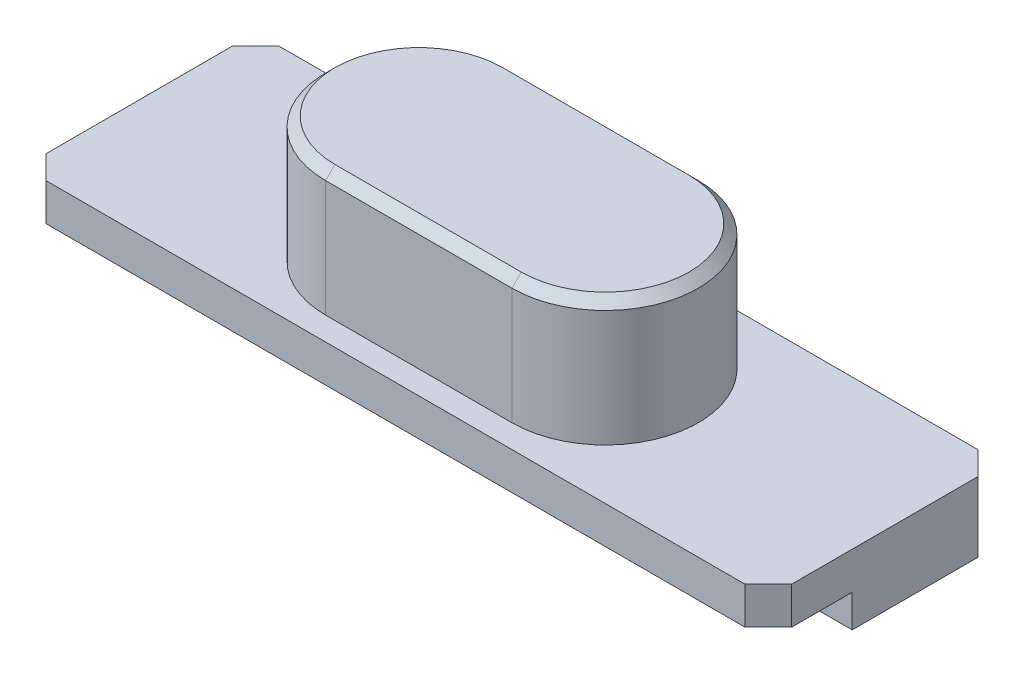
ISO-10303-21;
HEADER;
FILE_DESCRIPTION(('STEP AP214'),'2;1');
FILE_NAME('part.step','',(''),(''),'','','');
FILE_SCHEMA(('AUTOMOTIVE_DESIGN { 1 0 10303 214 1 1 1 1 }'));
ENDSEC;
DATA;
#1=APPLICATION_CONTEXT('core data for automotive mechanical design processes');
#2=APPLICATION_PROTOCOL_DEFINITION('international standard','automotive_design',2000,#1);
#3=PRODUCT_CONTEXT('',#1,'mechanical');
#4=PRODUCT('Part','Part','',(#3));
#5=PRODUCT_RELATED_PRODUCT_CATEGORY('part','',(#4));
#6=PRODUCT_DEFINITION_FORMATION('','',#4);
#7=PRODUCT_DEFINITION_CONTEXT('part definition',#1,'design');
#8=PRODUCT_DEFINITION('design','',#6,#7);
#9=PRODUCT_DEFINITION_SHAPE('','',#8);
#10=(LENGTH_UNIT() NAMED_UNIT(*) SI_UNIT(.MILLI.,.METRE.));
#11=(NAMED_UNIT(*) PLANE_ANGLE_UNIT() SI_UNIT($,.RADIAN.));
#12=(NAMED_UNIT(*) SI_UNIT($,.STERADIAN.) SOLID_ANGLE_UNIT());
#13=UNCERTAINTY_MEASURE_WITH_UNIT(LENGTH_MEASURE(1.E-05),#10,'distance_accuracy_value','');
#14=(GEOMETRIC_REPRESENTATION_CONTEXT(3) GLOBAL_UNCERTAINTY_ASSIGNED_CONTEXT((#13)) GLOBAL_UNIT_ASSIGNED_CONTEXT((#10,
#11,#12)) REPRESENTATION_CONTEXT('',''));
#15=CARTESIAN_POINT('',(0.,0.,0.));
#16=DIRECTION('',(0.,0.,1.));
#17=DIRECTION('',(1.,0.,0.));
#18=AXIS2_PLACEMENT_3D('',#15,#16,#17);
#19=CARTESIAN_POINT('',(0.7,-0.799999999999999,-2.5));
#20=DIRECTION('',(1.,0.,0.));
#21=DIRECTION('',(0.,1.,0.));
#22=AXIS2_PLACEMENT_3D('',#19,#20,#21);
#23=PLANE('',#22);
#24=DIRECTION('',(0.,1.,0.));
#25=VECTOR('',#24,1.);
#26=CARTESIAN_POINT('',(0.699999999999999,-0.8,0.700000000000002));
#27=LINE('',#26,#25);
#28=CARTESIAN_POINT('',(0.699999999999999,-2.,0.700000000000002));
#29=VERTEX_POINT('',#28);
#30=CARTESIAN_POINT('',(0.699999999999999,-0.799999999999999,0.700000000000002));
#31=VERTEX_POINT('',#30);
#32=EDGE_CURVE('E214',#29,#31,#27,.T.);
#33=ORIENTED_EDGE('',*,*,#32,.T.);
#34=DIRECTION('',(0.,0.,1.));
#35=VECTOR('',#34,1.);
#36=CARTESIAN_POINT('',(0.699999999999999,-0.799999999999999,-2.5));
#37=LINE('',#36,#35);
#38=CARTESIAN_POINT('',(0.699999999999999,-0.799999999999999,-2.5));
#39=VERTEX_POINT('',#38);
#40=EDGE_CURVE('E299',#31,#39,#37,.F.);
#41=ORIENTED_EDGE('',*,*,#40,.T.);
#42=DIRECTION('',(0.,1.,0.));
#43=VECTOR('',#42,1.);
#44=CARTESIAN_POINT('',(0.7,-0.799999999999999,-2.5));
#45=LINE('',#44,#43);
#46=CARTESIAN_POINT('',(0.699999999999999,-2.,-2.5));
#47=VERTEX_POINT('',#46);
#48=EDGE_CURVE('E227',#47,#39,#45,.T.);
#49=ORIENTED_EDGE('',*,*,#48,.F.);
#50=DIRECTION('',(0.,0.,-1.));
#51=VECTOR('',#50,1.);
#52=CARTESIAN_POINT('',(0.699999999999999,-2.,0.));
#53=LINE('',#52,#51);
#54=EDGE_CURVE('E277',#29,#47,#53,.T.);
#55=ORIENTED_EDGE('',*,*,#54,.F.);
#56=EDGE_LOOP('',(#33,#41,#49,#55));
#57=FACE_BOUND('',#56,.T.);
#58=ADVANCED_FACE('F17',(#57),#23,.F.);
#59=CARTESIAN_POINT('',(-3.,-1.5,-4.32464076412766));
#60=DIRECTION('',(1.,0.,0.));
#61=DIRECTION('',(0.,0.,-1.));
#62=AXIS2_PLACEMENT_3D('',#59,#60,#61);
#63=PLANE('',#62);
#64=DIRECTION('',(0.,1.,0.));
#65=VECTOR('',#64,1.);
#66=CARTESIAN_POINT('',(-3.,-0.8,0.700000000000002));
#67=LINE('',#66,#65);
#68=CARTESIAN_POINT('',(-3.,-2.,0.700000000000002));
#69=VERTEX_POINT('',#68);
#70=CARTESIAN_POINT('',(-3.,-1.5,0.700000000000002));
#71=VERTEX_POINT('',#70);
#72=EDGE_CURVE('E216',#69,#71,#67,.T.);
#73=ORIENTED_EDGE('',*,*,#72,.T.);
#74=DIRECTION('',(0.,0.,-1.));
#75=VECTOR('',#74,1.);
#76=CARTESIAN_POINT('',(-3.,-1.5,0.));
#77=LINE('',#76,#75);
#78=CARTESIAN_POINT('',(-3.,-1.5,-2.5));
#79=VERTEX_POINT('',#78);
#80=EDGE_CURVE('E266',#79,#71,#77,.F.);
#81=ORIENTED_EDGE('',*,*,#80,.F.);
#82=DIRECTION('',(0.,1.,0.));
#83=VECTOR('',#82,1.);
#84=CARTESIAN_POINT('',(-3.,-1.5,-2.5));
#85=LINE('',#84,#83);
#86=CARTESIAN_POINT('',(-3.,-2.,-2.5));
#87=VERTEX_POINT('',#86);
#88=EDGE_CURVE('E225',#87,#79,#85,.T.);
#89=ORIENTED_EDGE('',*,*,#88,.F.);
#90=DIRECTION('',(0.,0.,-1.));
#91=VECTOR('',#90,1.);
#92=CARTESIAN_POINT('',(-3.,-2.,0.));
#93=LINE('',#92,#91);
#94=EDGE_CURVE('E263',#69,#87,#93,.T.);
#95=ORIENTED_EDGE('',*,*,#94,.F.);
#96=EDGE_LOOP('',(#73,#81,#89,#95));
#97=FACE_BOUND('',#96,.T.);
#98=ADVANCED_FACE('F534',(#97),#63,.F.);
#99=CARTESIAN_POINT('',(-0.700000000000001,-0.799999999999999,-2.5));
#100=DIRECTION('',(-1.,0.,0.));
#101=DIRECTION('',(0.,-1.,0.));
#102=AXIS2_PLACEMENT_3D('',#99,#100,#101);
#103=PLANE('',#102);
#104=DIRECTION('',(0.,1.,0.));
#105=VECTOR('',#104,1.);
#106=CARTESIAN_POINT('',(-0.700000000000001,-0.8,0.700000000000002));
#107=LINE('',#106,#105);
#108=CARTESIAN_POINT('',(-0.700000000000001,-0.8,0.700000000000002));
#109=VERTEX_POINT('',#108);
#110=CARTESIAN_POINT('',(-0.700000000000001,-2.,0.700000000000002));
#111=VERTEX_POINT('',#110);
#112=EDGE_CURVE('E218',#109,#111,#107,.F.);
#113=ORIENTED_EDGE('',*,*,#112,.T.);
#114=DIRECTION('',(0.,0.,-1.));
#115=VECTOR('',#114,1.);
#116=CARTESIAN_POINT('',(-0.700000000000001,-2.,0.));
#117=LINE('',#116,#115);
#118=CARTESIAN_POINT('',(-0.700000000000001,-2.,-2.5));
#119=VERTEX_POINT('',#118);
#120=EDGE_CURVE('E261',#119,#111,#117,.F.);
#121=ORIENTED_EDGE('',*,*,#120,.F.);
#122=DIRECTION('',(0.,-1.,0.));
#123=VECTOR('',#122,1.);
#124=CARTESIAN_POINT('',(-0.700000000000001,-0.799999999999999,-2.5));
#125=LINE('',#124,#123);
#126=CARTESIAN_POINT('',(-0.700000000000001,-0.799999999999999,-2.5));
#127=VERTEX_POINT('',#126);
#128=EDGE_CURVE('E223',#127,#119,#125,.T.);
#129=ORIENTED_EDGE('',*,*,#128,.F.);
#130=DIRECTION('',(0.,0.,1.));
#131=VECTOR('',#130,1.);
#132=CARTESIAN_POINT('',(-0.700000000000001,-0.799999999999999,-2.5));
#133=LINE('',#132,#131);
#134=EDGE_CURVE('E294',#127,#109,#133,.T.);
#135=ORIENTED_EDGE('',*,*,#134,.T.);
#136=EDGE_LOOP('',(#113,#121,#129,#135));
#137=FACE_BOUND('',#136,.T.);
#138=ADVANCED_FACE('F510',(#137),#103,.F.);
#139=CARTESIAN_POINT('',(-8.,-0.8,0.700000000000002));
#140=DIRECTION('',(0.,0.,-1.));
#141=DIRECTION('',(-1.,0.,0.));
#142=AXIS2_PLACEMENT_3D('',#139,#140,#141);
#143=PLANE('',#142);
#144=ORIENTED_EDGE('',*,*,#72,.F.);
#145=DIRECTION('',(1.,0.,0.));
#146=VECTOR('',#145,1.);
#147=CARTESIAN_POINT('',(-5.5,-2.,0.700000000000002));
#148=LINE('',#147,#146);
#149=EDGE_CURVE('E258',#111,#69,#148,.F.);
#150=ORIENTED_EDGE('',*,*,#149,.F.);
#151=ORIENTED_EDGE('',*,*,#112,.F.);
#152=DIRECTION('',(1.,0.,0.));
#153=VECTOR('',#152,1.);
#154=CARTESIAN_POINT('',(-0.700000000000001,-0.799999999999999,0.700000000000002));
#155=LINE('',#154,#153);
#156=CARTESIAN_POINT('',(-8.,-0.8,0.700000000000002));
#157=VERTEX_POINT('',#156);
#158=EDGE_CURVE('E291',#109,#157,#155,.F.);
#159=ORIENTED_EDGE('',*,*,#158,.T.);
#160=DIRECTION('',(0.,1.,0.));
#161=VECTOR('',#160,1.);
#162=CARTESIAN_POINT('',(-8.,-0.8,0.700000000000002));
#163=LINE('',#162,#161);
#164=CARTESIAN_POINT('',(-8.,-1.5,0.700000000000002));
#165=VERTEX_POINT('',#164);
#166=EDGE_CURVE('E221',#165,#157,#163,.T.);
#167=ORIENTED_EDGE('',*,*,#166,.F.);
#168=DIRECTION('',(1.,0.,0.));
#169=VECTOR('',#168,1.);
#170=CARTESIAN_POINT('',(0.,-1.5,0.700000000000002));
#171=LINE('',#170,#169);
#172=EDGE_CURVE('E271',#71,#165,#171,.F.);
#173=ORIENTED_EDGE('',*,*,#172,.F.);
#174=EDGE_LOOP('',(#144,#150,#151,#159,#167,#173));
#175=FACE_BOUND('',#174,.T.);
#176=ADVANCED_FACE('F505',(#175),#143,.F.);
#177=CARTESIAN_POINT('',(-8.,-0.8,0.700000000000002));
#178=DIRECTION('',(0.,0.,-1.));
#179=DIRECTION('',(-1.,0.,0.));
#180=AXIS2_PLACEMENT_3D('',#177,#178,#179);
#181=PLANE('',#180);
#182=DIRECTION('',(0.,1.,0.));
#183=VECTOR('',#182,1.);
#184=CARTESIAN_POINT('',(3.,-1.5,0.700000000000002));
#185=LINE('',#184,#183);
#186=CARTESIAN_POINT('',(3.,-2.,0.700000000000002));
#187=VERTEX_POINT('',#186);
#188=CARTESIAN_POINT('',(3.,-1.5,0.700000000000002));
#189=VERTEX_POINT('',#188);
#190=EDGE_CURVE('E208',#187,#189,#185,.T.);
#191=ORIENTED_EDGE('',*,*,#190,.T.);
#192=DIRECTION('',(1.,0.,0.));
#193=VECTOR('',#192,1.);
#194=CARTESIAN_POINT('',(0.,-1.5,0.700000000000002));
#195=LINE('',#194,#193);
#196=CARTESIAN_POINT('',(8.,-1.5,0.700000000000002));
#197=VERTEX_POINT('',#196);
#198=EDGE_CURVE('E67',#197,#189,#195,.F.);
#199=ORIENTED_EDGE('',*,*,#198,.F.);
#200=DIRECTION('',(0.,1.,0.));
#201=VECTOR('',#200,1.);
#202=CARTESIAN_POINT('',(8.,-0.8,0.700000000000002));
#203=LINE('',#202,#201);
#204=CARTESIAN_POINT('',(8.,-0.8,0.700000000000002));
#205=VERTEX_POINT('',#204);
#206=EDGE_CURVE('E212',#205,#197,#203,.F.);
#207=ORIENTED_EDGE('',*,*,#206,.F.);
#208=DIRECTION('',(1.,0.,0.));
#209=VECTOR('',#208,1.);
#210=CARTESIAN_POINT('',(-0.700000000000001,-0.799999999999999,0.700000000000002));
#211=LINE('',#210,#209);
#212=EDGE_CURVE('E204',#205,#31,#211,.F.);
#213=ORIENTED_EDGE('',*,*,#212,.T.);
#214=ORIENTED_EDGE('',*,*,#32,.F.);
#215=DIRECTION('',(1.,0.,0.));
#216=VECTOR('',#215,1.);
#217=CARTESIAN_POINT('',(-5.5,-2.,0.700000000000002));
#218=LINE('',#217,#216);
#219=EDGE_CURVE('E280',#187,#29,#218,.F.);
#220=ORIENTED_EDGE('',*,*,#219,.F.);
#221=EDGE_LOOP('',(#191,#199,#207,#213,#214,#220));
#222=FACE_BOUND('',#221,.T.);
#223=ADVANCED_FACE('F305',(#222),#181,.F.);
#224=CARTESIAN_POINT('',(3.,-1.5,-3.78658965154207));
#225=DIRECTION('',(-1.,0.,0.));
#226=DIRECTION('',(0.,0.,1.));
#227=AXIS2_PLACEMENT_3D('',#224,#225,#226);
#228=PLANE('',#227);
#229=ORIENTED_EDGE('',*,*,#190,.F.);
#230=DIRECTION('',(0.,0.,-1.));
#231=VECTOR('',#230,1.);
#232=CARTESIAN_POINT('',(3.,-2.,0.));
#233=LINE('',#232,#231);
#234=CARTESIAN_POINT('',(3.,-2.,-2.5));
#235=VERTEX_POINT('',#234);
#236=EDGE_CURVE('E283',#235,#187,#233,.F.);
#237=ORIENTED_EDGE('',*,*,#236,.F.);
#238=DIRECTION('',(0.,1.,0.));
#239=VECTOR('',#238,1.);
#240=CARTESIAN_POINT('',(3.,-1.5,-2.5));
#241=LINE('',#240,#239);
#242=CARTESIAN_POINT('',(3.,-1.5,-2.5));
#243=VERTEX_POINT('',#242);
#244=EDGE_CURVE('E210',#243,#235,#241,.F.);
#245=ORIENTED_EDGE('',*,*,#244,.F.);
#246=DIRECTION('',(0.,0.,-1.));
#247=VECTOR('',#246,1.);
#248=CARTESIAN_POINT('',(3.,-1.5,0.));
#249=LINE('',#248,#247);
#250=EDGE_CURVE('E255',#189,#243,#249,.T.);
#251=ORIENTED_EDGE('',*,*,#250,.F.);
#252=EDGE_LOOP('',(#229,#237,#245,#251));
#253=FACE_BOUND('',#252,.T.);
#254=ADVANCED_FACE('F520',(#253),#228,.F.);
#255=CARTESIAN_POINT('',(-2.,2.7,0.));
#256=DIRECTION('',(0.,1.,0.));
#257=DIRECTION('',(0.,0.,1.));
#258=AXIS2_PLACEMENT_3D('',#255,#256,#257);
#259=PLANE('',#258);
#260=CARTESIAN_POINT('',(-2.,2.70000000000437,0.));
#261=DIRECTION('',(0.,-1.,0.));
#262=DIRECTION('',(0.,0.,-1.));
#263=AXIS2_PLACEMENT_3D('',#260,#261,#262);
#264=CIRCLE('',#263,1.80000000000291);
#265=CARTESIAN_POINT('',(-2.,2.70000000000218,1.79999999999783));
#266=VERTEX_POINT('',#265);
#267=CARTESIAN_POINT('',(-2.,2.70000000000437,-1.80000000000146));
#268=VERTEX_POINT('',#267);
#269=EDGE_CURVE('E198',#266,#268,#264,.T.);
#270=ORIENTED_EDGE('',*,*,#269,.F.);
#271=DIRECTION('',(1.,0.,0.));
#272=VECTOR('',#271,1.);
#273=CARTESIAN_POINT('',(-2.,2.7,1.80000000000001));
#274=LINE('',#273,#272);
#275=CARTESIAN_POINT('',(2.,2.70000000000218,1.79999999999783));
#276=VERTEX_POINT('',#275);
#277=EDGE_CURVE('E192',#276,#266,#274,.F.);
#278=ORIENTED_EDGE('',*,*,#277,.F.);
#279=CARTESIAN_POINT('',(2.,2.70000000000437,0.));
#280=DIRECTION('',(0.,-1.,0.));
#281=DIRECTION('',(0.,0.,-1.));
#282=AXIS2_PLACEMENT_3D('',#279,#280,#281);
#283=CIRCLE('',#282,1.80000000000291);
#284=CARTESIAN_POINT('',(2.,2.70000000000218,-1.79999999999783));
#285=VERTEX_POINT('',#284);
#286=EDGE_CURVE('E20',#285,#276,#283,.T.);
#287=ORIENTED_EDGE('',*,*,#286,.F.);
#288=DIRECTION('',(1.,0.,0.));
#289=VECTOR('',#288,1.);
#290=CARTESIAN_POINT('',(-2.,2.7,-1.80000000000001));
#291=LINE('',#290,#289);
#292=EDGE_CURVE('E206',#268,#285,#291,.T.);
#293=ORIENTED_EDGE('',*,*,#292,.F.);
#294=EDGE_LOOP('',(#270,#278,#287,#293));
#295=FACE_BOUND('',#294,.T.);
#296=ADVANCED_FACE('F197',(#295),#259,.T.);
#297=CARTESIAN_POINT('',(-0.700000000000001,-0.799999999999999,-2.5));
#298=DIRECTION('',(0.,1.,0.));
#299=DIRECTION('',(0.,0.,1.));
#300=AXIS2_PLACEMENT_3D('',#297,#298,#299);
#301=PLANE('',#300);
#302=DIRECTION('',(0.707106781186549,0.,-0.707106781186546));
#303=VECTOR('',#302,1.);
#304=CARTESIAN_POINT('',(8.,-0.800000000000002,2.));
#305=LINE('',#304,#303);
#306=CARTESIAN_POINT('',(7.49999999999999,-0.800000000000001,2.5));
#307=VERTEX_POINT('',#306);
#308=CARTESIAN_POINT('',(8.,-0.8,2.));
#309=VERTEX_POINT('',#308);
#310=EDGE_CURVE('E179',#307,#309,#305,.T.);
#311=ORIENTED_EDGE('',*,*,#310,.F.);
#312=DIRECTION('',(-1.,0.,0.));
#313=VECTOR('',#312,1.);
#314=CARTESIAN_POINT('',(-5.5,-0.799999999999999,2.5));
#315=LINE('',#314,#313);
#316=CARTESIAN_POINT('',(-7.5,-0.799999999999999,2.5));
#317=VERTEX_POINT('',#316);
#318=EDGE_CURVE('E359',#307,#317,#315,.T.);
#319=ORIENTED_EDGE('',*,*,#318,.T.);
#320=DIRECTION('',(0.707106781186545,0.,0.70710678118655));
#321=VECTOR('',#320,1.);
#322=CARTESIAN_POINT('',(-8.,-0.799999999999999,2.));
#323=LINE('',#322,#321);
#324=CARTESIAN_POINT('',(-8.,-0.799999999999999,2.));
#325=VERTEX_POINT('',#324);
#326=EDGE_CURVE('E177',#325,#317,#323,.T.);
#327=ORIENTED_EDGE('',*,*,#326,.F.);
#328=DIRECTION('',(0.,0.,1.));
#329=VECTOR('',#328,1.);
#330=CARTESIAN_POINT('',(-8.,-0.799999999999999,-2.5));
#331=LINE('',#330,#329);
#332=EDGE_CURVE('E288',#157,#325,#331,.T.);
#333=ORIENTED_EDGE('',*,*,#332,.F.);
#334=ORIENTED_EDGE('',*,*,#158,.F.);
#335=ORIENTED_EDGE('',*,*,#134,.F.);
#336=DIRECTION('',(1.,0.,0.));
#337=VECTOR('',#336,1.);
#338=CARTESIAN_POINT('',(-0.700000000000001,-0.799999999999999,-2.5));
#339=LINE('',#338,#337);
#340=EDGE_CURVE('E297',#39,#127,#339,.F.);
#341=ORIENTED_EDGE('',*,*,#340,.F.);
#342=ORIENTED_EDGE('',*,*,#40,.F.);
#343=ORIENTED_EDGE('',*,*,#212,.F.);
#344=DIRECTION('',(0.,0.,1.));
#345=VECTOR('',#344,1.);
#346=CARTESIAN_POINT('',(8.,-0.799999999999999,-2.5));
#347=LINE('',#346,#345);
#348=EDGE_CURVE('E132',#309,#205,#347,.F.);
#349=ORIENTED_EDGE('',*,*,#348,.F.);
#350=EDGE_LOOP('',(#311,#319,#327,#333,#334,#335,#341,#342,#343,#349));
#351=FACE_BOUND('',#350,.T.);
#352=ADVANCED_FACE('F307',(#351),#301,.F.);
#353=CARTESIAN_POINT('',(-5.5,-2.,0.));
#354=DIRECTION('',(0.,-1.,0.));
#355=DIRECTION('',(0.,0.,-1.));
#356=AXIS2_PLACEMENT_3D('',#353,#354,#355);
#357=PLANE('',#356);
#358=ORIENTED_EDGE('',*,*,#54,.T.);
#359=DIRECTION('',(1.,0.,0.));
#360=VECTOR('',#359,1.);
#361=CARTESIAN_POINT('',(-5.5,-2.,-2.5));
#362=LINE('',#361,#360);
#363=EDGE_CURVE('E346',#47,#235,#362,.T.);
#364=ORIENTED_EDGE('',*,*,#363,.T.);
#365=ORIENTED_EDGE('',*,*,#236,.T.);
#366=ORIENTED_EDGE('',*,*,#219,.T.);
#367=EDGE_LOOP('',(#358,#364,#365,#366));
#368=FACE_BOUND('',#367,.T.);
#369=ADVANCED_FACE('F516',(#368),#357,.T.);
#370=CARTESIAN_POINT('',(-8.,5.59016994374948,-2.));
#371=DIRECTION('',(-0.707106781186547,0.,-0.707106781186548));
#372=DIRECTION('',(-0.707106781186548,0.,0.707106781186547));
#373=AXIS2_PLACEMENT_3D('',#370,#371,#372);
#374=PLANE('',#373);
#375=DIRECTION('',(0.,1.,0.));
#376=VECTOR('',#375,1.);
#377=CARTESIAN_POINT('',(-8.,5.59016994374948,-2.));
#378=LINE('',#377,#376);
#379=CARTESIAN_POINT('',(-8.,0.,-2.));
#380=VERTEX_POINT('',#379);
#381=CARTESIAN_POINT('',(-8.,-1.5,-2.));
#382=VERTEX_POINT('',#381);
#383=EDGE_CURVE('E355',#380,#382,#378,.F.);
#384=ORIENTED_EDGE('',*,*,#383,.F.);
#385=DIRECTION('',(-0.707106781186548,0.,0.707106781186547));
#386=VECTOR('',#385,1.);
#387=CARTESIAN_POINT('',(-8.,0.,-2.));
#388=LINE('',#387,#386);
#389=CARTESIAN_POINT('',(-7.5,0.,-2.5));
#390=VERTEX_POINT('',#389);
#391=EDGE_CURVE('E274',#380,#390,#388,.F.);
#392=ORIENTED_EDGE('',*,*,#391,.T.);
#393=DIRECTION('',(0.,1.,0.));
#394=VECTOR('',#393,1.);
#395=CARTESIAN_POINT('',(-7.5,-2.,-2.5));
#396=LINE('',#395,#394);
#397=CARTESIAN_POINT('',(-7.5,-1.5,-2.5));
#398=VERTEX_POINT('',#397);
#399=EDGE_CURVE('E337',#390,#398,#396,.F.);
#400=ORIENTED_EDGE('',*,*,#399,.T.);
#401=DIRECTION('',(0.707106781186549,0.,-0.707106781186546));
#402=VECTOR('',#401,1.);
#403=CARTESIAN_POINT('',(-8.,-1.5,-2.));
#404=LINE('',#403,#402);
#405=EDGE_CURVE('E269',#382,#398,#404,.T.);
#406=ORIENTED_EDGE('',*,*,#405,.F.);
#407=EDGE_LOOP('',(#384,#392,#400,#406));
#408=FACE_BOUND('',#407,.T.);
#409=ADVANCED_FACE('F497',(#408),#374,.T.);
#410=CARTESIAN_POINT('',(0.,-1.5,0.));
#411=DIRECTION('',(0.,-1.,0.));
#412=DIRECTION('',(0.,0.,-1.));
#413=AXIS2_PLACEMENT_3D('',#410,#411,#412);
#414=PLANE('',#413);
#415=DIRECTION('',(1.,0.,0.));
#416=VECTOR('',#415,1.);
#417=CARTESIAN_POINT('',(-5.5,-1.5,-2.5));
#418=LINE('',#417,#416);
#419=EDGE_CURVE('E334',#398,#79,#418,.T.);
#420=ORIENTED_EDGE('',*,*,#419,.T.);
#421=ORIENTED_EDGE('',*,*,#80,.T.);
#422=ORIENTED_EDGE('',*,*,#172,.T.);
#423=DIRECTION('',(0.,0.,1.));
#424=VECTOR('',#423,1.);
#425=CARTESIAN_POINT('',(-8.,-1.5,2.5));
#426=LINE('',#425,#424);
#427=EDGE_CURVE('E352',#382,#165,#426,.T.);
#428=ORIENTED_EDGE('',*,*,#427,.F.);
#429=ORIENTED_EDGE('',*,*,#405,.T.);
#430=EDGE_LOOP('',(#420,#421,#422,#428,#429));
#431=FACE_BOUND('',#430,.T.);
#432=ADVANCED_FACE('F501',(#431),#414,.T.);
#433=CARTESIAN_POINT('',(-5.5,-2.,0.));
#434=DIRECTION('',(0.,-1.,0.));
#435=DIRECTION('',(0.,0.,-1.));
#436=AXIS2_PLACEMENT_3D('',#433,#434,#435);
#437=PLANE('',#436);
#438=ORIENTED_EDGE('',*,*,#120,.T.);
#439=ORIENTED_EDGE('',*,*,#149,.T.);
#440=ORIENTED_EDGE('',*,*,#94,.T.);
#441=DIRECTION('',(1.,0.,0.));
#442=VECTOR('',#441,1.);
#443=CARTESIAN_POINT('',(-5.5,-2.,-2.5));
#444=LINE('',#443,#442);
#445=EDGE_CURVE('E331',#87,#119,#444,.T.);
#446=ORIENTED_EDGE('',*,*,#445,.T.);
#447=EDGE_LOOP('',(#438,#439,#440,#446));
#448=FACE_BOUND('',#447,.T.);
#449=ADVANCED_FACE('F542',(#448),#437,.T.);
#450=CARTESIAN_POINT('',(0.,-1.5,0.));
#451=DIRECTION('',(0.,-1.,0.));
#452=DIRECTION('',(0.,0.,-1.));
#453=AXIS2_PLACEMENT_3D('',#450,#451,#452);
#454=PLANE('',#453);
#455=DIRECTION('',(-0.707106781186548,0.,-0.707106781186547));
#456=VECTOR('',#455,1.);
#457=CARTESIAN_POINT('',(7.5,-1.5,-2.5));
#458=LINE('',#457,#456);
#459=CARTESIAN_POINT('',(8.,-1.5,-2.));
#460=VERTEX_POINT('',#459);
#461=CARTESIAN_POINT('',(7.5,-1.5,-2.5));
#462=VERTEX_POINT('',#461);
#463=EDGE_CURVE('E253',#460,#462,#458,.T.);
#464=ORIENTED_EDGE('',*,*,#463,.F.);
#465=DIRECTION('',(0.,0.,-1.));
#466=VECTOR('',#465,1.);
#467=CARTESIAN_POINT('',(8.,-1.5,2.5));
#468=LINE('',#467,#466);
#469=EDGE_CURVE('E324',#197,#460,#468,.T.);
#470=ORIENTED_EDGE('',*,*,#469,.F.);
#471=ORIENTED_EDGE('',*,*,#198,.T.);
#472=ORIENTED_EDGE('',*,*,#250,.T.);
#473=DIRECTION('',(1.,0.,0.));
#474=VECTOR('',#473,1.);
#475=CARTESIAN_POINT('',(-5.5,-1.5,-2.5));
#476=LINE('',#475,#474);
#477=EDGE_CURVE('E343',#243,#462,#476,.T.);
#478=ORIENTED_EDGE('',*,*,#477,.T.);
#479=EDGE_LOOP('',(#464,#470,#471,#472,#478));
#480=FACE_BOUND('',#479,.T.);
#481=ADVANCED_FACE('F490',(#480),#454,.T.);
#482=CARTESIAN_POINT('',(7.5,-2.,-2.5));
#483=DIRECTION('',(0.707106781186547,0.,-0.707106781186548));
#484=DIRECTION('',(-0.707106781186548,0.,-0.707106781186547));
#485=AXIS2_PLACEMENT_3D('',#482,#483,#484);
#486=PLANE('',#485);
#487=DIRECTION('',(0.,1.,0.));
#488=VECTOR('',#487,1.);
#489=CARTESIAN_POINT('',(7.5,-2.,-2.5));
#490=LINE('',#489,#488);
#491=CARTESIAN_POINT('',(7.5,0.,-2.5));
#492=VERTEX_POINT('',#491);
#493=EDGE_CURVE('E340',#462,#492,#490,.T.);
#494=ORIENTED_EDGE('',*,*,#493,.T.);
#495=DIRECTION('',(-0.707106781186548,0.,-0.707106781186547));
#496=VECTOR('',#495,1.);
#497=CARTESIAN_POINT('',(7.5,0.,-2.5));
#498=LINE('',#497,#496);
#499=CARTESIAN_POINT('',(8.,0.,-2.));
#500=VERTEX_POINT('',#499);
#501=EDGE_CURVE('E187',#492,#500,#498,.F.);
#502=ORIENTED_EDGE('',*,*,#501,.T.);
#503=DIRECTION('',(0.,1.,0.));
#504=VECTOR('',#503,1.);
#505=CARTESIAN_POINT('',(8.,5.59016994374948,-2.));
#506=LINE('',#505,#504);
#507=EDGE_CURVE('E320',#460,#500,#506,.T.);
#508=ORIENTED_EDGE('',*,*,#507,.F.);
#509=ORIENTED_EDGE('',*,*,#463,.T.);
#510=EDGE_LOOP('',(#494,#502,#508,#509));
#511=FACE_BOUND('',#510,.T.);
#512=ADVANCED_FACE('F486',(#511),#486,.T.);
#513=CARTESIAN_POINT('',(2.,2.49999999999773,0.));
#514=DIRECTION('',(0.,-1.,0.));
#515=DIRECTION('',(0.,0.,-1.));
#516=AXIS2_PLACEMENT_3D('',#513,#514,#515);
#517=CONICAL_SURFACE('',#516,2.00000000000955,0.785398163397448);
#518=DIRECTION('',(0.,0.707106781186548,0.707106781186547));
#519=VECTOR('',#518,1.);
#520=CARTESIAN_POINT('',(2.,2.7,-1.80000000000001));
#521=LINE('',#520,#519);
#522=CARTESIAN_POINT('',(2.,2.50000000000001,-2.));
#523=VERTEX_POINT('',#522);
#524=EDGE_CURVE('E123',#285,#523,#521,.F.);
#525=ORIENTED_EDGE('',*,*,#524,.F.);
#526=ORIENTED_EDGE('',*,*,#286,.T.);
#527=DIRECTION('',(0.,-0.707106781186548,0.707106781186547));
#528=VECTOR('',#527,1.);
#529=CARTESIAN_POINT('',(2.,2.7,1.80000000000001));
#530=LINE('',#529,#528);
#531=CARTESIAN_POINT('',(2.,2.50000000000001,2.));
#532=VERTEX_POINT('',#531);
#533=EDGE_CURVE('E185',#532,#276,#530,.F.);
#534=ORIENTED_EDGE('',*,*,#533,.F.);
#535=CARTESIAN_POINT('',(2.,2.50000000000001,0.));
#536=DIRECTION('',(0.,-1.,0.));
#537=DIRECTION('',(0.,0.,-1.));
#538=AXIS2_PLACEMENT_3D('',#535,#536,#537);
#539=CIRCLE('',#538,2.);
#540=EDGE_CURVE('E319',#523,#532,#539,.T.);
#541=ORIENTED_EDGE('',*,*,#540,.F.);
#542=EDGE_LOOP('',(#525,#526,#534,#541));
#543=FACE_BOUND('',#542,.T.);
#544=ADVANCED_FACE('F184',(#543),#517,.T.);
#545=CARTESIAN_POINT('',(-2.,2.7,-1.80000000000001));
#546=DIRECTION('',(0.,0.707106781186547,-0.707106781186548));
#547=DIRECTION('',(0.,0.707106781186548,0.707106781186547));
#548=AXIS2_PLACEMENT_3D('',#545,#546,#547);
#549=PLANE('',#548);
#550=DIRECTION('',(0.,0.707106781186548,0.707106781186547));
#551=VECTOR('',#550,1.);
#552=CARTESIAN_POINT('',(-2.,-498995.500000001,-499000.));
#553=LINE('',#552,#551);
#554=CARTESIAN_POINT('',(-2.,2.49999999999944,-2.00000000000239));
#555=VERTEX_POINT('',#554);
#556=EDGE_CURVE('E235',#268,#555,#553,.F.);
#557=ORIENTED_EDGE('',*,*,#556,.F.);
#558=ORIENTED_EDGE('',*,*,#292,.T.);
#559=ORIENTED_EDGE('',*,*,#524,.T.);
#560=DIRECTION('',(1.,0.,0.));
#561=VECTOR('',#560,1.);
#562=CARTESIAN_POINT('',(-2.,2.50000000000001,-2.));
#563=LINE('',#562,#561);
#564=EDGE_CURVE('E376',#523,#555,#563,.F.);
#565=ORIENTED_EDGE('',*,*,#564,.T.);
#566=EDGE_LOOP('',(#557,#558,#559,#565));
#567=FACE_BOUND('',#566,.T.);
#568=ADVANCED_FACE('F422',(#567),#549,.T.);
#569=CARTESIAN_POINT('',(-2.,2.49999999999773,0.));
#570=DIRECTION('',(0.,-1.,0.));
#571=DIRECTION('',(0.,0.,-1.));
#572=AXIS2_PLACEMENT_3D('',#569,#570,#571);
#573=CONICAL_SURFACE('',#572,2.00000000000955,0.785398163397448);
#574=ORIENTED_EDGE('',*,*,#556,.T.);
#575=CARTESIAN_POINT('',(-2.,2.50000000000001,0.));
#576=DIRECTION('',(0.,-1.,0.));
#577=DIRECTION('',(0.,0.,-1.));
#578=AXIS2_PLACEMENT_3D('',#575,#576,#577);
#579=CIRCLE('',#578,2.);
#580=CARTESIAN_POINT('',(-2.,2.50000000000001,2.));
#581=VERTEX_POINT('',#580);
#582=EDGE_CURVE('E373',#581,#555,#579,.T.);
#583=ORIENTED_EDGE('',*,*,#582,.F.);
#584=DIRECTION('',(0.,-0.707106781186548,0.707106781186547));
#585=VECTOR('',#584,1.);
#586=CARTESIAN_POINT('',(-2.,2.7,1.80000000000001));
#587=LINE('',#586,#585);
#588=EDGE_CURVE('E195',#266,#581,#587,.T.);
#589=ORIENTED_EDGE('',*,*,#588,.F.);
#590=ORIENTED_EDGE('',*,*,#269,.T.);
#591=EDGE_LOOP('',(#574,#583,#589,#590));
#592=FACE_BOUND('',#591,.T.);
#593=ADVANCED_FACE('F420',(#592),#573,.T.);
#594=CARTESIAN_POINT('',(-2.,2.7,1.80000000000001));
#595=DIRECTION('',(0.,0.707106781186547,0.707106781186548));
#596=DIRECTION('',(0.,-0.707106781186548,0.707106781186547));
#597=AXIS2_PLACEMENT_3D('',#594,#595,#596);
#598=PLANE('',#597);
#599=ORIENTED_EDGE('',*,*,#533,.T.);
#600=ORIENTED_EDGE('',*,*,#277,.T.);
#601=ORIENTED_EDGE('',*,*,#588,.T.);
#602=DIRECTION('',(-1.,0.,0.));
#603=VECTOR('',#602,1.);
#604=CARTESIAN_POINT('',(-2.,2.50000000000001,2.));
#605=LINE('',#604,#603);
#606=EDGE_CURVE('E194',#581,#532,#605,.F.);
#607=ORIENTED_EDGE('',*,*,#606,.T.);
#608=EDGE_LOOP('',(#599,#600,#601,#607));
#609=FACE_BOUND('',#608,.T.);
#610=ADVANCED_FACE('F191',(#609),#598,.T.);
#611=CARTESIAN_POINT('',(8.,5.59016994374948,2.));
#612=DIRECTION('',(0.707106781186546,0.,0.707106781186549));
#613=DIRECTION('',(0.707106781186549,0.,-0.707106781186546));
#614=AXIS2_PLACEMENT_3D('',#611,#612,#613);
#615=PLANE('',#614);
#616=ORIENTED_EDGE('',*,*,#310,.T.);
#617=DIRECTION('',(0.,1.,0.));
#618=VECTOR('',#617,1.);
#619=CARTESIAN_POINT('',(8.,5.59016994374948,2.));
#620=LINE('',#619,#618);
#621=CARTESIAN_POINT('',(8.,0.,2.));
#622=VERTEX_POINT('',#621);
#623=EDGE_CURVE('E314',#622,#309,#620,.F.);
#624=ORIENTED_EDGE('',*,*,#623,.F.);
#625=DIRECTION('',(-0.70710678118655,0.,0.707106781186545));
#626=VECTOR('',#625,1.);
#627=CARTESIAN_POINT('',(8.,0.,2.));
#628=LINE('',#627,#626);
#629=CARTESIAN_POINT('',(7.49999999999999,0.,2.5));
#630=VERTEX_POINT('',#629);
#631=EDGE_CURVE('E390',#622,#630,#628,.T.);
#632=ORIENTED_EDGE('',*,*,#631,.T.);
#633=DIRECTION('',(0.,1.,0.));
#634=VECTOR('',#633,1.);
#635=CARTESIAN_POINT('',(7.49999999999999,-2.,2.5));
#636=LINE('',#635,#634);
#637=EDGE_CURVE('E200',#630,#307,#636,.F.);
#638=ORIENTED_EDGE('',*,*,#637,.T.);
#639=EDGE_LOOP('',(#616,#624,#632,#638));
#640=FACE_BOUND('',#639,.T.);
#641=ADVANCED_FACE('F429',(#640),#615,.T.);
#642=CARTESIAN_POINT('',(-5.5,-2.,2.5));
#643=DIRECTION('',(0.,0.,-1.));
#644=DIRECTION('',(-1.,0.,0.));
#645=AXIS2_PLACEMENT_3D('',#642,#643,#644);
#646=PLANE('',#645);
#647=ORIENTED_EDGE('',*,*,#637,.F.);
#648=DIRECTION('',(1.,0.,0.));
#649=VECTOR('',#648,1.);
#650=CARTESIAN_POINT('',(-5.5,0.,2.5));
#651=LINE('',#650,#649);
#652=CARTESIAN_POINT('',(-7.5,0.,2.5));
#653=VERTEX_POINT('',#652);
#654=EDGE_CURVE('E395',#630,#653,#651,.F.);
#655=ORIENTED_EDGE('',*,*,#654,.T.);
#656=DIRECTION('',(0.,1.,0.));
#657=VECTOR('',#656,1.);
#658=CARTESIAN_POINT('',(-7.5,-2.,2.5));
#659=LINE('',#658,#657);
#660=EDGE_CURVE('E357',#317,#653,#659,.T.);
#661=ORIENTED_EDGE('',*,*,#660,.F.);
#662=ORIENTED_EDGE('',*,*,#318,.F.);
#663=EDGE_LOOP('',(#647,#655,#661,#662));
#664=FACE_BOUND('',#663,.T.);
#665=ADVANCED_FACE('F458',(#664),#646,.F.);
#666=CARTESIAN_POINT('',(-7.5,-2.,2.5));
#667=DIRECTION('',(-0.707106781186549,0.,0.707106781186546));
#668=DIRECTION('',(0.707106781186546,0.,0.707106781186549));
#669=AXIS2_PLACEMENT_3D('',#666,#667,#668);
#670=PLANE('',#669);
#671=ORIENTED_EDGE('',*,*,#326,.T.);
#672=ORIENTED_EDGE('',*,*,#660,.T.);
#673=DIRECTION('',(-0.707106781186546,0.,-0.707106781186549));
#674=VECTOR('',#673,1.);
#675=CARTESIAN_POINT('',(-7.5,0.,2.5));
#676=LINE('',#675,#674);
#677=CARTESIAN_POINT('',(-8.,0.,2.));
#678=VERTEX_POINT('',#677);
#679=EDGE_CURVE('E398',#653,#678,#676,.T.);
#680=ORIENTED_EDGE('',*,*,#679,.T.);
#681=DIRECTION('',(0.,1.,0.));
#682=VECTOR('',#681,1.);
#683=CARTESIAN_POINT('',(-8.,5.59016994374948,2.));
#684=LINE('',#683,#682);
#685=EDGE_CURVE('E349',#325,#678,#684,.T.);
#686=ORIENTED_EDGE('',*,*,#685,.F.);
#687=EDGE_LOOP('',(#671,#672,#680,#686));
#688=FACE_BOUND('',#687,.T.);
#689=ADVANCED_FACE('F454',(#688),#670,.T.);
#690=CARTESIAN_POINT('',(-8.,5.59016994374948,2.5));
#691=DIRECTION('',(-1.,0.,0.));
#692=DIRECTION('',(0.,0.,1.));
#693=AXIS2_PLACEMENT_3D('',#690,#691,#692);
#694=PLANE('',#693);
#695=ORIENTED_EDGE('',*,*,#685,.T.);
#696=DIRECTION('',(0.,0.,-1.));
#697=VECTOR('',#696,1.);
#698=CARTESIAN_POINT('',(-8.,0.,0.));
#699=LINE('',#698,#697);
#700=EDGE_CURVE('E401',#678,#380,#699,.T.);
#701=ORIENTED_EDGE('',*,*,#700,.T.);
#702=ORIENTED_EDGE('',*,*,#383,.T.);
#703=ORIENTED_EDGE('',*,*,#427,.T.);
#704=ORIENTED_EDGE('',*,*,#166,.T.);
#705=ORIENTED_EDGE('',*,*,#332,.T.);
#706=EDGE_LOOP('',(#695,#701,#702,#703,#704,#705));
#707=FACE_BOUND('',#706,.T.);
#708=ADVANCED_FACE('F450',(#707),#694,.T.);
#709=CARTESIAN_POINT('',(-5.5,-2.,-2.5));
#710=DIRECTION('',(0.,0.,1.));
#711=DIRECTION('',(1.,0.,0.));
#712=AXIS2_PLACEMENT_3D('',#709,#710,#711);
#713=PLANE('',#712);
#714=ORIENTED_EDGE('',*,*,#88,.T.);
#715=ORIENTED_EDGE('',*,*,#419,.F.);
#716=ORIENTED_EDGE('',*,*,#399,.F.);
#717=DIRECTION('',(1.,0.,0.));
#718=VECTOR('',#717,1.);
#719=CARTESIAN_POINT('',(-5.5,0.,-2.5));
#720=LINE('',#719,#718);
#721=EDGE_CURVE('E404',#390,#492,#720,.T.);
#722=ORIENTED_EDGE('',*,*,#721,.T.);
#723=ORIENTED_EDGE('',*,*,#493,.F.);
#724=ORIENTED_EDGE('',*,*,#477,.F.);
#725=ORIENTED_EDGE('',*,*,#244,.T.);
#726=ORIENTED_EDGE('',*,*,#363,.F.);
#727=ORIENTED_EDGE('',*,*,#48,.T.);
#728=ORIENTED_EDGE('',*,*,#340,.T.);
#729=ORIENTED_EDGE('',*,*,#128,.T.);
#730=ORIENTED_EDGE('',*,*,#445,.F.);
#731=EDGE_LOOP('',(#714,#715,#716,#722,#723,#724,#725,#726,#727,#728,#729,#730));
#732=FACE_BOUND('',#731,.T.);
#733=ADVANCED_FACE('F447',(#732),#713,.F.);
#734=CARTESIAN_POINT('',(8.,5.59016994374948,2.5));
#735=DIRECTION('',(1.,0.,0.));
#736=DIRECTION('',(0.,0.,-1.));
#737=AXIS2_PLACEMENT_3D('',#734,#735,#736);
#738=PLANE('',#737);
#739=ORIENTED_EDGE('',*,*,#623,.T.);
#740=ORIENTED_EDGE('',*,*,#348,.T.);
#741=ORIENTED_EDGE('',*,*,#206,.T.);
#742=ORIENTED_EDGE('',*,*,#469,.T.);
#743=ORIENTED_EDGE('',*,*,#507,.T.);
#744=DIRECTION('',(0.,0.,-1.));
#745=VECTOR('',#744,1.);
#746=CARTESIAN_POINT('',(8.,0.,0.));
#747=LINE('',#746,#745);
#748=EDGE_CURVE('E234',#500,#622,#747,.F.);
#749=ORIENTED_EDGE('',*,*,#748,.T.);
#750=EDGE_LOOP('',(#739,#740,#741,#742,#743,#749));
#751=FACE_BOUND('',#750,.T.);
#752=ADVANCED_FACE('F311',(#751),#738,.T.);
#753=CARTESIAN_POINT('',(2.,2.7,0.));
#754=DIRECTION('',(0.,-1.,0.));
#755=DIRECTION('',(0.,0.,-1.));
#756=AXIS2_PLACEMENT_3D('',#753,#754,#755);
#757=CYLINDRICAL_SURFACE('',#756,2.);
#758=DIRECTION('',(0.,1.,0.));
#759=VECTOR('',#758,1.);
#760=CARTESIAN_POINT('',(2.,2.7,2.));
#761=LINE('',#760,#759);
#762=CARTESIAN_POINT('',(2.,0.,2.));
#763=VERTEX_POINT('',#762);
#764=EDGE_CURVE('E366',#532,#763,#761,.F.);
#765=ORIENTED_EDGE('',*,*,#764,.T.);
#766=CARTESIAN_POINT('',(2.,0.,0.));
#767=DIRECTION('',(0.,-1.,0.));
#768=DIRECTION('',(0.,0.,-1.));
#769=AXIS2_PLACEMENT_3D('',#766,#767,#768);
#770=CIRCLE('',#769,2.);
#771=CARTESIAN_POINT('',(2.,0.,-2.));
#772=VERTEX_POINT('',#771);
#773=EDGE_CURVE('E232',#763,#772,#770,.F.);
#774=ORIENTED_EDGE('',*,*,#773,.T.);
#775=DIRECTION('',(0.,1.,0.));
#776=VECTOR('',#775,1.);
#777=CARTESIAN_POINT('',(2.,2.7,-2.));
#778=LINE('',#777,#776);
#779=EDGE_CURVE('E322',#772,#523,#778,.T.);
#780=ORIENTED_EDGE('',*,*,#779,.T.);
#781=ORIENTED_EDGE('',*,*,#540,.T.);
#782=EDGE_LOOP('',(#765,#774,#780,#781));
#783=FACE_BOUND('',#782,.T.);
#784=ADVANCED_FACE('F416',(#783),#757,.T.);
#785=CARTESIAN_POINT('',(-2.,2.7,-2.));
#786=DIRECTION('',(0.,0.,1.));
#787=DIRECTION('',(1.,0.,0.));
#788=AXIS2_PLACEMENT_3D('',#785,#786,#787);
#789=PLANE('',#788);
#790=ORIENTED_EDGE('',*,*,#564,.F.);
#791=ORIENTED_EDGE('',*,*,#779,.F.);
#792=DIRECTION('',(1.,0.,0.));
#793=VECTOR('',#792,1.);
#794=CARTESIAN_POINT('',(-5.5,0.,-2.));
#795=LINE('',#794,#793);
#796=CARTESIAN_POINT('',(-2.,0.,-2.));
#797=VERTEX_POINT('',#796);
#798=EDGE_CURVE('E231',#772,#797,#795,.F.);
#799=ORIENTED_EDGE('',*,*,#798,.T.);
#800=DIRECTION('',(0.,-1.,0.));
#801=VECTOR('',#800,1.);
#802=CARTESIAN_POINT('',(-2.,2.7,-2.));
#803=LINE('',#802,#801);
#804=EDGE_CURVE('E375',#555,#797,#803,.T.);
#805=ORIENTED_EDGE('',*,*,#804,.F.);
#806=EDGE_LOOP('',(#790,#791,#799,#805));
#807=FACE_BOUND('',#806,.T.);
#808=ADVANCED_FACE('F411',(#807),#789,.F.);
#809=CARTESIAN_POINT('',(-2.,2.7,0.));
#810=DIRECTION('',(0.,-1.,0.));
#811=DIRECTION('',(0.,0.,-1.));
#812=AXIS2_PLACEMENT_3D('',#809,#810,#811);
#813=CYLINDRICAL_SURFACE('',#812,2.);
#814=ORIENTED_EDGE('',*,*,#804,.T.);
#815=CARTESIAN_POINT('',(-2.,0.,0.));
#816=DIRECTION('',(0.,-1.,0.));
#817=DIRECTION('',(0.,0.,-1.));
#818=AXIS2_PLACEMENT_3D('',#815,#816,#817);
#819=CIRCLE('',#818,2.);
#820=CARTESIAN_POINT('',(-2.,0.,2.));
#821=VERTEX_POINT('',#820);
#822=EDGE_CURVE('E26',#797,#821,#819,.F.);
#823=ORIENTED_EDGE('',*,*,#822,.T.);
#824=DIRECTION('',(0.,1.,0.));
#825=VECTOR('',#824,1.);
#826=CARTESIAN_POINT('',(-2.,2.7,2.));
#827=LINE('',#826,#825);
#828=EDGE_CURVE('E34',#821,#581,#827,.T.);
#829=ORIENTED_EDGE('',*,*,#828,.T.);
#830=ORIENTED_EDGE('',*,*,#582,.T.);
#831=EDGE_LOOP('',(#814,#823,#829,#830));
#832=FACE_BOUND('',#831,.T.);
#833=ADVANCED_FACE('F419',(#832),#813,.T.);
#834=CARTESIAN_POINT('',(-2.,2.7,2.));
#835=DIRECTION('',(0.,0.,-1.));
#836=DIRECTION('',(-1.,0.,0.));
#837=AXIS2_PLACEMENT_3D('',#834,#835,#836);
#838=PLANE('',#837);
#839=ORIENTED_EDGE('',*,*,#606,.F.);
#840=ORIENTED_EDGE('',*,*,#828,.F.);
#841=DIRECTION('',(1.,0.,0.));
#842=VECTOR('',#841,1.);
#843=CARTESIAN_POINT('',(-5.5,0.,2.));
#844=LINE('',#843,#842);
#845=EDGE_CURVE('E11',#821,#763,#844,.T.);
#846=ORIENTED_EDGE('',*,*,#845,.T.);
#847=ORIENTED_EDGE('',*,*,#764,.F.);
#848=EDGE_LOOP('',(#839,#840,#846,#847));
#849=FACE_BOUND('',#848,.T.);
#850=ADVANCED_FACE('F417',(#849),#838,.F.);
#851=CARTESIAN_POINT('',(-5.5,0.,0.));
#852=DIRECTION('',(0.,-1.,0.));
#853=DIRECTION('',(0.,0.,-1.));
#854=AXIS2_PLACEMENT_3D('',#851,#852,#853);
#855=PLANE('',#854);
#856=ORIENTED_EDGE('',*,*,#822,.F.);
#857=ORIENTED_EDGE('',*,*,#798,.F.);
#858=ORIENTED_EDGE('',*,*,#773,.F.);
#859=ORIENTED_EDGE('',*,*,#845,.F.);
#860=EDGE_LOOP('',(#856,#857,#858,#859));
#861=FACE_BOUND('',#860,.T.);
#862=ORIENTED_EDGE('',*,*,#501,.F.);
#863=ORIENTED_EDGE('',*,*,#721,.F.);
#864=ORIENTED_EDGE('',*,*,#391,.F.);
#865=ORIENTED_EDGE('',*,*,#700,.F.);
#866=ORIENTED_EDGE('',*,*,#679,.F.);
#867=ORIENTED_EDGE('',*,*,#654,.F.);
#868=ORIENTED_EDGE('',*,*,#631,.F.);
#869=ORIENTED_EDGE('',*,*,#748,.F.);
#870=EDGE_LOOP('',(#862,#863,#864,#865,#866,#867,#868,#869));
#871=FACE_BOUND('',#870,.T.);
#872=ADVANCED_FACE('F414',(#861,#871),#855,.F.);
#873=CLOSED_SHELL('',(#58,#98,#138,#176,#223,#254,#296,#352,#369,#409,#432,#449,#481,#512,#544,
#568,#593,#610,#641,#665,#689,#708,#733,#752,#784,#808,#833,#850,#872));
#874=MANIFOLD_SOLID_BREP('B1',#873);
#875=ADVANCED_BREP_SHAPE_REPRESENTATION('',(#18,#874),#14);
#876=SHAPE_DEFINITION_REPRESENTATION(#9,#875);
ENDSEC;
END-ISO-10303-21;
